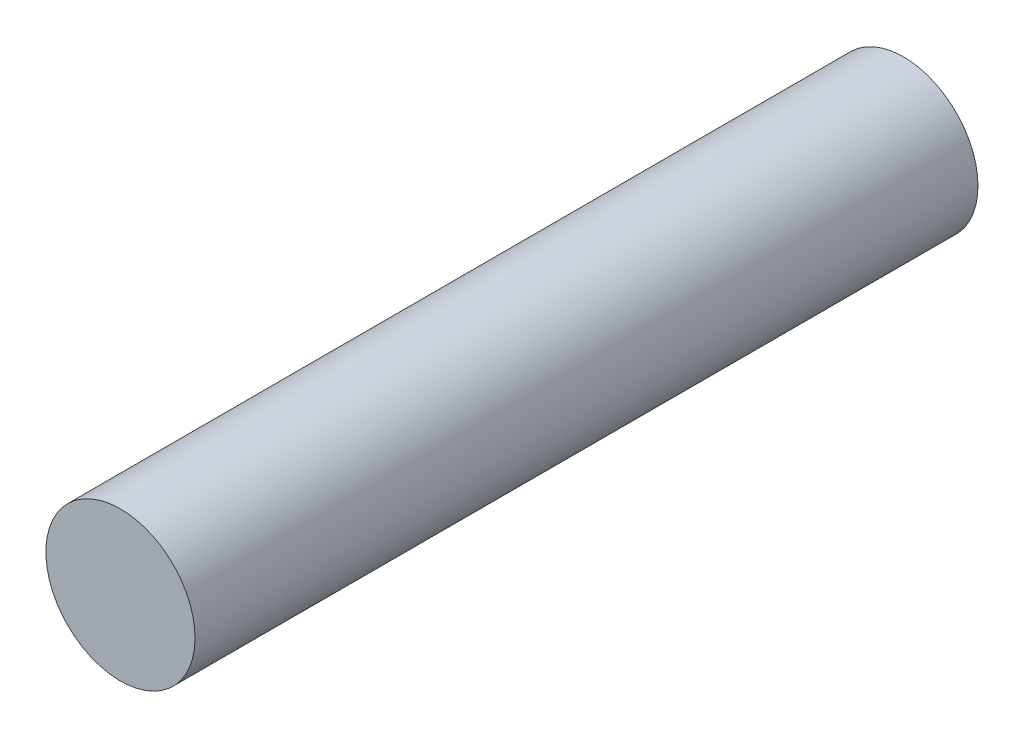
ISO-10303-21;
HEADER;
FILE_DESCRIPTION(('STEP AP214'),'2;1');
FILE_NAME('part.step','',(''),(''),'','','');
FILE_SCHEMA(('AUTOMOTIVE_DESIGN { 1 0 10303 214 1 1 1 1 }'));
ENDSEC;
DATA;
#1=APPLICATION_CONTEXT('core data for automotive mechanical design processes');
#2=APPLICATION_PROTOCOL_DEFINITION('international standard','automotive_design',2000,#1);
#3=PRODUCT_CONTEXT('',#1,'mechanical');
#4=PRODUCT('Part','Part','',(#3));
#5=PRODUCT_RELATED_PRODUCT_CATEGORY('part','',(#4));
#6=PRODUCT_DEFINITION_FORMATION('','',#4);
#7=PRODUCT_DEFINITION_CONTEXT('part definition',#1,'design');
#8=PRODUCT_DEFINITION('design','',#6,#7);
#9=PRODUCT_DEFINITION_SHAPE('','',#8);
#10=(LENGTH_UNIT() NAMED_UNIT(*) SI_UNIT(.MILLI.,.METRE.));
#11=(NAMED_UNIT(*) PLANE_ANGLE_UNIT() SI_UNIT($,.RADIAN.));
#12=(NAMED_UNIT(*) SI_UNIT($,.STERADIAN.) SOLID_ANGLE_UNIT());
#13=UNCERTAINTY_MEASURE_WITH_UNIT(LENGTH_MEASURE(1.E-05),#10,'distance_accuracy_value','');
#14=(GEOMETRIC_REPRESENTATION_CONTEXT(3) GLOBAL_UNCERTAINTY_ASSIGNED_CONTEXT((#13)) GLOBAL_UNIT_ASSIGNED_CONTEXT((#10,
#11,#12)) REPRESENTATION_CONTEXT('',''));
#15=CARTESIAN_POINT('',(0.,0.,0.));
#16=DIRECTION('',(0.,0.,1.));
#17=DIRECTION('',(1.,0.,0.));
#18=AXIS2_PLACEMENT_3D('',#15,#16,#17);
#19=CARTESIAN_POINT('',(0.,0.,50.));
#20=DIRECTION('',(0.,0.,-1.));
#21=DIRECTION('',(-1.,0.,0.));
#22=AXIS2_PLACEMENT_3D('',#19,#20,#21);
#23=CYLINDRICAL_SURFACE('',#22,4.7625);
#24=CARTESIAN_POINT('',(0.,0.,50.));
#25=DIRECTION('',(0.,0.,1.));
#26=DIRECTION('',(1.,0.,0.));
#27=AXIS2_PLACEMENT_3D('',#24,#25,#26);
#28=CIRCLE('',#27,4.7625);
#29=CARTESIAN_POINT('',(4.7625,0.,50.));
#30=VERTEX_POINT('',#29);
#31=EDGE_CURVE('E10',#30,#30,#28,.T.);
#32=ORIENTED_EDGE('',*,*,#31,.F.);
#33=EDGE_LOOP('',(#32));
#34=FACE_BOUND('',#33,.T.);
#35=CARTESIAN_POINT('',(0.,0.,0.));
#36=DIRECTION('',(0.,0.,1.));
#37=DIRECTION('',(1.,0.,0.));
#38=AXIS2_PLACEMENT_3D('',#35,#36,#37);
#39=CIRCLE('',#38,4.7625);
#40=CARTESIAN_POINT('',(4.7625,0.,0.));
#41=VERTEX_POINT('',#40);
#42=EDGE_CURVE('E36',#41,#41,#39,.T.);
#43=ORIENTED_EDGE('',*,*,#42,.T.);
#44=EDGE_LOOP('',(#43));
#45=FACE_BOUND('',#44,.T.);
#46=ADVANCED_FACE('F33',(#34,#45),#23,.T.);
#47=CARTESIAN_POINT('',(0.,0.,50.));
#48=DIRECTION('',(0.,0.,1.));
#49=DIRECTION('',(1.,0.,0.));
#50=AXIS2_PLACEMENT_3D('',#47,#48,#49);
#51=PLANE('',#50);
#52=ORIENTED_EDGE('',*,*,#31,.T.);
#53=EDGE_LOOP('',(#52));
#54=FACE_BOUND('',#53,.T.);
#55=ADVANCED_FACE('F48',(#54),#51,.T.);
#56=CARTESIAN_POINT('',(0.,0.,0.));
#57=DIRECTION('',(0.,0.,1.));
#58=DIRECTION('',(1.,0.,0.));
#59=AXIS2_PLACEMENT_3D('',#56,#57,#58);
#60=PLANE('',#59);
#61=ORIENTED_EDGE('',*,*,#42,.F.);
#62=EDGE_LOOP('',(#61));
#63=FACE_BOUND('',#62,.T.);
#64=ADVANCED_FACE('F46',(#63),#60,.F.);
#65=CLOSED_SHELL('',(#46,#55,#64));
#66=MANIFOLD_SOLID_BREP('B2',#65);
#67=ADVANCED_BREP_SHAPE_REPRESENTATION('',(#18,#66),#14);
#68=SHAPE_DEFINITION_REPRESENTATION(#9,#67);
ENDSEC;
END-ISO-10303-21;
